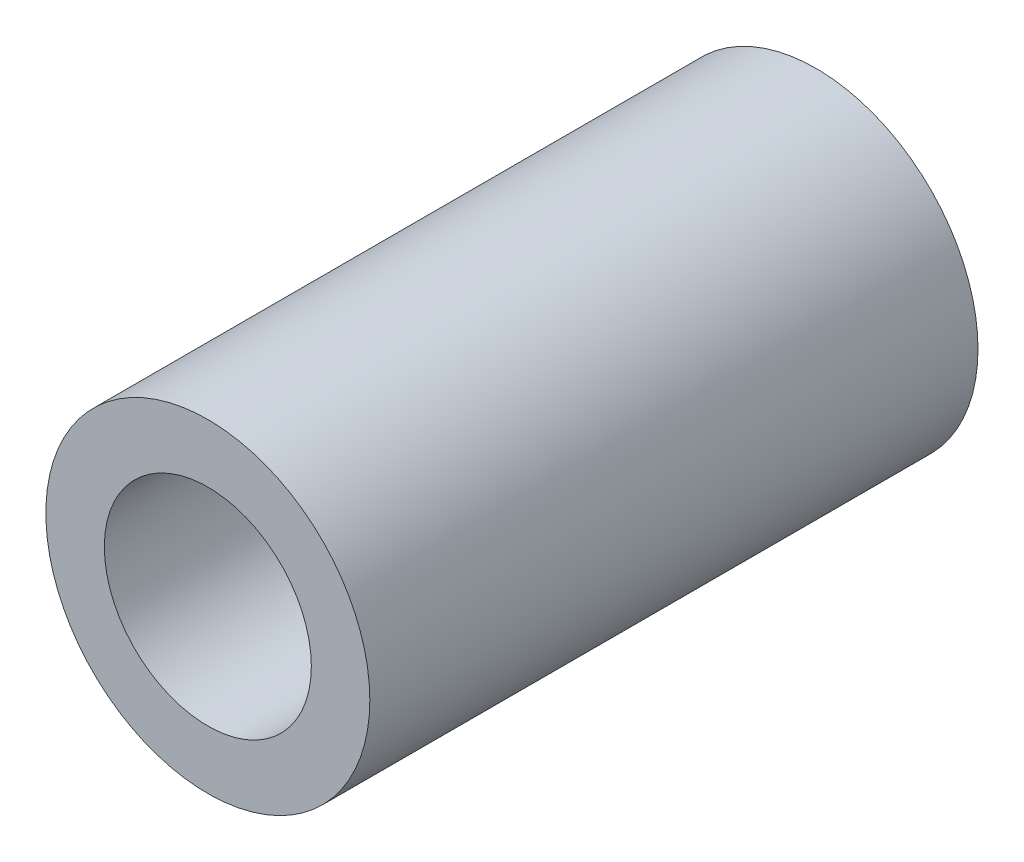
ISO-10303-21;
HEADER;
FILE_DESCRIPTION(('STEP AP214'),'2;1');
FILE_NAME('part.step','',(''),(''),'','','');
FILE_SCHEMA(('AUTOMOTIVE_DESIGN { 1 0 10303 214 1 1 1 1 }'));
ENDSEC;
DATA;
#1=APPLICATION_CONTEXT('core data for automotive mechanical design processes');
#2=APPLICATION_PROTOCOL_DEFINITION('international standard','automotive_design',2000,#1);
#3=PRODUCT_CONTEXT('',#1,'mechanical');
#4=PRODUCT('Part','Part','',(#3));
#5=PRODUCT_RELATED_PRODUCT_CATEGORY('part','',(#4));
#6=PRODUCT_DEFINITION_FORMATION('','',#4);
#7=PRODUCT_DEFINITION_CONTEXT('part definition',#1,'design');
#8=PRODUCT_DEFINITION('design','',#6,#7);
#9=PRODUCT_DEFINITION_SHAPE('','',#8);
#10=(LENGTH_UNIT() NAMED_UNIT(*) SI_UNIT(.MILLI.,.METRE.));
#11=(NAMED_UNIT(*) PLANE_ANGLE_UNIT() SI_UNIT($,.RADIAN.));
#12=(NAMED_UNIT(*) SI_UNIT($,.STERADIAN.) SOLID_ANGLE_UNIT());
#13=UNCERTAINTY_MEASURE_WITH_UNIT(LENGTH_MEASURE(1.E-05),#10,'distance_accuracy_value','');
#14=(GEOMETRIC_REPRESENTATION_CONTEXT(3) GLOBAL_UNCERTAINTY_ASSIGNED_CONTEXT((#13)) GLOBAL_UNIT_ASSIGNED_CONTEXT((#10,
#11,#12)) REPRESENTATION_CONTEXT('',''));
#15=CARTESIAN_POINT('',(0.,0.,0.));
#16=DIRECTION('',(0.,0.,1.));
#17=DIRECTION('',(1.,0.,0.));
#18=AXIS2_PLACEMENT_3D('',#15,#16,#17);
#19=CARTESIAN_POINT('',(0.,0.,20.8));
#20=DIRECTION('',(0.,0.,-1.));
#21=DIRECTION('',(-1.,0.,0.));
#22=AXIS2_PLACEMENT_3D('',#19,#20,#21);
#23=CYLINDRICAL_SURFACE('',#22,3.54);
#24=CARTESIAN_POINT('',(0.,0.,20.8));
#25=DIRECTION('',(0.,0.,1.));
#26=DIRECTION('',(1.,0.,0.));
#27=AXIS2_PLACEMENT_3D('',#24,#25,#26);
#28=CIRCLE('',#27,3.54);
#29=CARTESIAN_POINT('',(3.54,0.,20.8));
#30=VERTEX_POINT('',#29);
#31=EDGE_CURVE('E51',#30,#30,#28,.T.);
#32=ORIENTED_EDGE('',*,*,#31,.T.);
#33=EDGE_LOOP('',(#32));
#34=FACE_BOUND('',#33,.T.);
#35=CARTESIAN_POINT('',(0.,0.,0.));
#36=DIRECTION('',(0.,0.,1.));
#37=DIRECTION('',(1.,0.,0.));
#38=AXIS2_PLACEMENT_3D('',#35,#36,#37);
#39=CIRCLE('',#38,3.54);
#40=CARTESIAN_POINT('',(3.54,0.,0.));
#41=VERTEX_POINT('',#40);
#42=EDGE_CURVE('E58',#41,#41,#39,.T.);
#43=ORIENTED_EDGE('',*,*,#42,.F.);
#44=EDGE_LOOP('',(#43));
#45=FACE_BOUND('',#44,.T.);
#46=ADVANCED_FACE('F43',(#34,#45),#23,.F.);
#47=CARTESIAN_POINT('',(0.,0.,20.8));
#48=DIRECTION('',(0.,0.,-1.));
#49=DIRECTION('',(-1.,0.,0.));
#50=AXIS2_PLACEMENT_3D('',#47,#48,#49);
#51=CYLINDRICAL_SURFACE('',#50,5.54);
#52=CARTESIAN_POINT('',(0.,0.,20.8));
#53=DIRECTION('',(0.,0.,1.));
#54=DIRECTION('',(1.,0.,0.));
#55=AXIS2_PLACEMENT_3D('',#52,#53,#54);
#56=CIRCLE('',#55,5.54);
#57=CARTESIAN_POINT('',(5.54,0.,20.8));
#58=VERTEX_POINT('',#57);
#59=EDGE_CURVE('E10',#58,#58,#56,.T.);
#60=ORIENTED_EDGE('',*,*,#59,.F.);
#61=EDGE_LOOP('',(#60));
#62=FACE_BOUND('',#61,.T.);
#63=CARTESIAN_POINT('',(0.,0.,0.));
#64=DIRECTION('',(0.,0.,1.));
#65=DIRECTION('',(1.,0.,0.));
#66=AXIS2_PLACEMENT_3D('',#63,#64,#65);
#67=CIRCLE('',#66,5.54);
#68=CARTESIAN_POINT('',(5.54,0.,0.));
#69=VERTEX_POINT('',#68);
#70=EDGE_CURVE('E46',#69,#69,#67,.T.);
#71=ORIENTED_EDGE('',*,*,#70,.T.);
#72=EDGE_LOOP('',(#71));
#73=FACE_BOUND('',#72,.T.);
#74=ADVANCED_FACE('F67',(#62,#73),#51,.T.);
#75=CARTESIAN_POINT('',(0.,0.,20.8));
#76=DIRECTION('',(0.,0.,1.));
#77=DIRECTION('',(1.,0.,0.));
#78=AXIS2_PLACEMENT_3D('',#75,#76,#77);
#79=PLANE('',#78);
#80=ORIENTED_EDGE('',*,*,#31,.F.);
#81=EDGE_LOOP('',(#80));
#82=FACE_BOUND('',#81,.T.);
#83=ORIENTED_EDGE('',*,*,#59,.T.);
#84=EDGE_LOOP('',(#83));
#85=FACE_BOUND('',#84,.T.);
#86=ADVANCED_FACE('F71',(#82,#85),#79,.T.);
#87=CARTESIAN_POINT('',(0.,0.,0.));
#88=DIRECTION('',(0.,0.,1.));
#89=DIRECTION('',(1.,0.,0.));
#90=AXIS2_PLACEMENT_3D('',#87,#88,#89);
#91=PLANE('',#90);
#92=ORIENTED_EDGE('',*,*,#42,.T.);
#93=EDGE_LOOP('',(#92));
#94=FACE_BOUND('',#93,.T.);
#95=ORIENTED_EDGE('',*,*,#70,.F.);
#96=EDGE_LOOP('',(#95));
#97=FACE_BOUND('',#96,.T.);
#98=ADVANCED_FACE('F69',(#94,#97),#91,.F.);
#99=CLOSED_SHELL('',(#46,#74,#86,#98));
#100=MANIFOLD_SOLID_BREP('B2',#99);
#101=ADVANCED_BREP_SHAPE_REPRESENTATION('',(#18,#100),#14);
#102=SHAPE_DEFINITION_REPRESENTATION(#9,#101);
ENDSEC;
END-ISO-10303-21;
